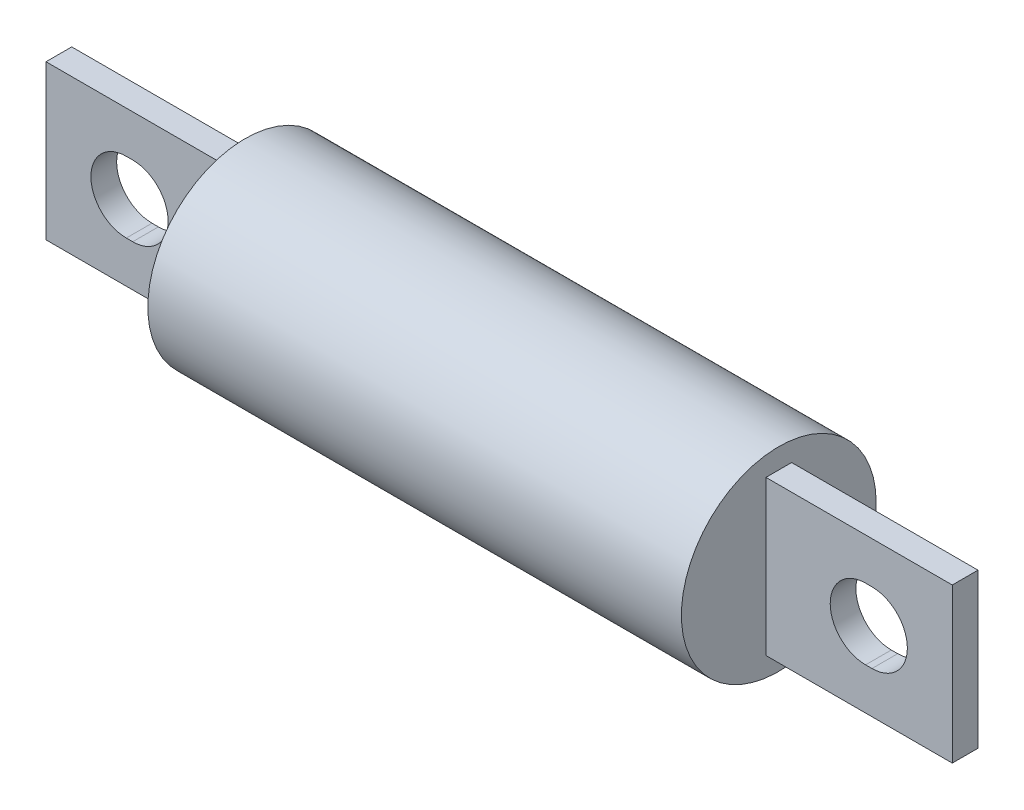
ISO-10303-21;
HEADER;
FILE_DESCRIPTION(('STEP AP214'),'2;1');
FILE_NAME('part.step','',(''),(''),'','','');
FILE_SCHEMA(('AUTOMOTIVE_DESIGN { 1 0 10303 214 1 1 1 1 }'));
ENDSEC;
DATA;
#1=APPLICATION_CONTEXT('core data for automotive mechanical design processes');
#2=APPLICATION_PROTOCOL_DEFINITION('international standard','automotive_design',2000,#1);
#3=PRODUCT_CONTEXT('',#1,'mechanical');
#4=PRODUCT('Part','Part','',(#3));
#5=PRODUCT_RELATED_PRODUCT_CATEGORY('part','',(#4));
#6=PRODUCT_DEFINITION_FORMATION('','',#4);
#7=PRODUCT_DEFINITION_CONTEXT('part definition',#1,'design');
#8=PRODUCT_DEFINITION('design','',#6,#7);
#9=PRODUCT_DEFINITION_SHAPE('','',#8);
#10=(LENGTH_UNIT() NAMED_UNIT(*) SI_UNIT(.MILLI.,.METRE.));
#11=(NAMED_UNIT(*) PLANE_ANGLE_UNIT() SI_UNIT($,.RADIAN.));
#12=(NAMED_UNIT(*) SI_UNIT($,.STERADIAN.) SOLID_ANGLE_UNIT());
#13=UNCERTAINTY_MEASURE_WITH_UNIT(LENGTH_MEASURE(1.E-05),#10,'distance_accuracy_value','');
#14=(GEOMETRIC_REPRESENTATION_CONTEXT(3) GLOBAL_UNCERTAINTY_ASSIGNED_CONTEXT((#13)) GLOBAL_UNIT_ASSIGNED_CONTEXT((#10,
#11,#12)) REPRESENTATION_CONTEXT('',''));
#15=CARTESIAN_POINT('',(0.,0.,0.));
#16=DIRECTION('',(0.,0.,1.));
#17=DIRECTION('',(1.,0.,0.));
#18=AXIS2_PLACEMENT_3D('',#15,#16,#17);
#19=CARTESIAN_POINT('',(65.8876,0.,0.));
#20=DIRECTION('',(-1.,0.,0.));
#21=DIRECTION('',(0.,0.,1.));
#22=AXIS2_PLACEMENT_3D('',#19,#20,#21);
#23=CYLINDRICAL_SURFACE('',#22,12.0269);
#24=CARTESIAN_POINT('',(65.8876,0.,0.));
#25=DIRECTION('',(1.,0.,0.));
#26=DIRECTION('',(0.,0.,-1.));
#27=AXIS2_PLACEMENT_3D('',#24,#25,#26);
#28=CIRCLE('',#27,12.0269);
#29=CARTESIAN_POINT('',(65.8876,0.,-12.0269));
#30=VERTEX_POINT('',#29);
#31=EDGE_CURVE('E255',#30,#30,#28,.T.);
#32=ORIENTED_EDGE('',*,*,#31,.F.);
#33=EDGE_LOOP('',(#32));
#34=FACE_BOUND('',#33,.T.);
#35=CARTESIAN_POINT('',(0.,0.,0.));
#36=DIRECTION('',(1.,0.,0.));
#37=DIRECTION('',(0.,0.,-1.));
#38=AXIS2_PLACEMENT_3D('',#35,#36,#37);
#39=CIRCLE('',#38,12.0269);
#40=CARTESIAN_POINT('',(0.,0.,-12.0269));
#41=VERTEX_POINT('',#40);
#42=EDGE_CURVE('E254',#41,#41,#39,.T.);
#43=ORIENTED_EDGE('',*,*,#42,.T.);
#44=EDGE_LOOP('',(#43));
#45=FACE_BOUND('',#44,.T.);
#46=ADVANCED_FACE('F37',(#34,#45),#23,.T.);
#47=CARTESIAN_POINT('',(65.8876,0.,0.));
#48=DIRECTION('',(1.,0.,0.));
#49=DIRECTION('',(0.,0.,-1.));
#50=AXIS2_PLACEMENT_3D('',#47,#48,#49);
#51=PLANE('',#50);
#52=DIRECTION('',(0.,1.,0.));
#53=VECTOR('',#52,1.);
#54=CARTESIAN_POINT('',(65.8876,0.,-1.5875));
#55=LINE('',#54,#53);
#56=CARTESIAN_POINT('',(65.8876,-9.525,-1.5875));
#57=VERTEX_POINT('',#56);
#58=CARTESIAN_POINT('',(65.8876,9.525,-1.5875));
#59=VERTEX_POINT('',#58);
#60=EDGE_CURVE('E251',#57,#59,#55,.T.);
#61=ORIENTED_EDGE('',*,*,#60,.F.);
#62=DIRECTION('',(0.,0.,-1.));
#63=VECTOR('',#62,1.);
#64=CARTESIAN_POINT('',(65.8876,-9.525,0.));
#65=LINE('',#64,#63);
#66=CARTESIAN_POINT('',(65.8876,-9.525,1.5875));
#67=VERTEX_POINT('',#66);
#68=EDGE_CURVE('E248',#67,#57,#65,.T.);
#69=ORIENTED_EDGE('',*,*,#68,.F.);
#70=DIRECTION('',(0.,-1.,0.));
#71=VECTOR('',#70,1.);
#72=CARTESIAN_POINT('',(65.8876,0.,1.5875));
#73=LINE('',#72,#71);
#74=CARTESIAN_POINT('',(65.8876,9.525,1.5875));
#75=VERTEX_POINT('',#74);
#76=EDGE_CURVE('E245',#75,#67,#73,.T.);
#77=ORIENTED_EDGE('',*,*,#76,.F.);
#78=DIRECTION('',(0.,0.,1.));
#79=VECTOR('',#78,1.);
#80=CARTESIAN_POINT('',(65.8876,9.525,0.));
#81=LINE('',#80,#79);
#82=EDGE_CURVE('E231',#59,#75,#81,.T.);
#83=ORIENTED_EDGE('',*,*,#82,.F.);
#84=EDGE_LOOP('',(#61,#69,#77,#83));
#85=FACE_BOUND('',#84,.T.);
#86=ORIENTED_EDGE('',*,*,#31,.T.);
#87=EDGE_LOOP('',(#86));
#88=FACE_BOUND('',#87,.T.);
#89=ADVANCED_FACE('F316',(#85,#88),#51,.T.);
#90=CARTESIAN_POINT('',(0.,0.,0.));
#91=DIRECTION('',(1.,0.,0.));
#92=DIRECTION('',(0.,0.,-1.));
#93=AXIS2_PLACEMENT_3D('',#90,#91,#92);
#94=PLANE('',#93);
#95=DIRECTION('',(0.,0.,-1.));
#96=VECTOR('',#95,1.);
#97=CARTESIAN_POINT('',(0.,-9.525,0.));
#98=LINE('',#97,#96);
#99=CARTESIAN_POINT('',(0.,-9.525,1.5875));
#100=VERTEX_POINT('',#99);
#101=CARTESIAN_POINT('',(0.,-9.525,-1.5875));
#102=VERTEX_POINT('',#101);
#103=EDGE_CURVE('E266',#100,#102,#98,.T.);
#104=ORIENTED_EDGE('',*,*,#103,.T.);
#105=DIRECTION('',(0.,1.,0.));
#106=VECTOR('',#105,1.);
#107=CARTESIAN_POINT('',(0.,0.,-1.5875));
#108=LINE('',#107,#106);
#109=CARTESIAN_POINT('',(0.,9.525,-1.5875));
#110=VERTEX_POINT('',#109);
#111=EDGE_CURVE('E269',#102,#110,#108,.T.);
#112=ORIENTED_EDGE('',*,*,#111,.T.);
#113=DIRECTION('',(0.,0.,1.));
#114=VECTOR('',#113,1.);
#115=CARTESIAN_POINT('',(0.,9.525,0.));
#116=LINE('',#115,#114);
#117=CARTESIAN_POINT('',(0.,9.525,1.5875));
#118=VERTEX_POINT('',#117);
#119=EDGE_CURVE('E258',#110,#118,#116,.T.);
#120=ORIENTED_EDGE('',*,*,#119,.T.);
#121=DIRECTION('',(0.,-1.,0.));
#122=VECTOR('',#121,1.);
#123=CARTESIAN_POINT('',(0.,0.,1.5875));
#124=LINE('',#123,#122);
#125=EDGE_CURVE('E263',#118,#100,#124,.T.);
#126=ORIENTED_EDGE('',*,*,#125,.T.);
#127=EDGE_LOOP('',(#104,#112,#120,#126));
#128=FACE_BOUND('',#127,.T.);
#129=ORIENTED_EDGE('',*,*,#42,.F.);
#130=EDGE_LOOP('',(#129));
#131=FACE_BOUND('',#130,.T.);
#132=ADVANCED_FACE('F338',(#128,#131),#94,.F.);
#133=CARTESIAN_POINT('',(-23.0124,0.,0.));
#134=DIRECTION('',(1.,0.,0.));
#135=DIRECTION('',(0.,0.,-1.));
#136=AXIS2_PLACEMENT_3D('',#133,#134,#135);
#137=PLANE('',#136);
#138=DIRECTION('',(0.,1.,0.));
#139=VECTOR('',#138,1.);
#140=CARTESIAN_POINT('',(-23.0124,9.525,-1.5875));
#141=LINE('',#140,#139);
#142=CARTESIAN_POINT('',(-23.0124,-9.525,-1.5875));
#143=VERTEX_POINT('',#142);
#144=CARTESIAN_POINT('',(-23.0124,9.525,-1.5875));
#145=VERTEX_POINT('',#144);
#146=EDGE_CURVE('E215',#143,#145,#141,.T.);
#147=ORIENTED_EDGE('',*,*,#146,.F.);
#148=DIRECTION('',(0.,0.,-1.));
#149=VECTOR('',#148,1.);
#150=CARTESIAN_POINT('',(-23.0124,-9.525,1.5875));
#151=LINE('',#150,#149);
#152=CARTESIAN_POINT('',(-23.0124,-9.525,1.5875));
#153=VERTEX_POINT('',#152);
#154=EDGE_CURVE('E224',#153,#143,#151,.T.);
#155=ORIENTED_EDGE('',*,*,#154,.F.);
#156=DIRECTION('',(0.,-1.,0.));
#157=VECTOR('',#156,1.);
#158=CARTESIAN_POINT('',(-23.0124,9.525,1.5875));
#159=LINE('',#158,#157);
#160=CARTESIAN_POINT('',(-23.0124,9.525,1.5875));
#161=VERTEX_POINT('',#160);
#162=EDGE_CURVE('E221',#161,#153,#159,.T.);
#163=ORIENTED_EDGE('',*,*,#162,.F.);
#164=DIRECTION('',(0.,0.,1.));
#165=VECTOR('',#164,1.);
#166=CARTESIAN_POINT('',(-23.0124,9.525,1.5875));
#167=LINE('',#166,#165);
#168=EDGE_CURVE('E218',#145,#161,#167,.T.);
#169=ORIENTED_EDGE('',*,*,#168,.F.);
#170=EDGE_LOOP('',(#147,#155,#163,#169));
#171=FACE_BOUND('',#170,.T.);
#172=ADVANCED_FACE('F331',(#171),#137,.F.);
#173=CARTESIAN_POINT('',(-23.0124,9.525,1.5875));
#174=DIRECTION('',(0.,1.,0.));
#175=DIRECTION('',(0.,0.,1.));
#176=AXIS2_PLACEMENT_3D('',#173,#174,#175);
#177=PLANE('',#176);
#178=ORIENTED_EDGE('',*,*,#119,.F.);
#179=DIRECTION('',(1.,0.,0.));
#180=VECTOR('',#179,1.);
#181=CARTESIAN_POINT('',(-23.0124,9.525,-1.5875));
#182=LINE('',#181,#180);
#183=EDGE_CURVE('E240',#145,#110,#182,.T.);
#184=ORIENTED_EDGE('',*,*,#183,.F.);
#185=ORIENTED_EDGE('',*,*,#168,.T.);
#186=DIRECTION('',(1.,0.,0.));
#187=VECTOR('',#186,1.);
#188=CARTESIAN_POINT('',(-23.0124,9.525,1.5875));
#189=LINE('',#188,#187);
#190=EDGE_CURVE('E237',#161,#118,#189,.T.);
#191=ORIENTED_EDGE('',*,*,#190,.T.);
#192=EDGE_LOOP('',(#178,#184,#185,#191));
#193=FACE_BOUND('',#192,.T.);
#194=ADVANCED_FACE('F322',(#193),#177,.T.);
#195=CARTESIAN_POINT('',(-23.0124,9.525,1.5875));
#196=DIRECTION('',(0.,0.,1.));
#197=DIRECTION('',(0.,-1.,0.));
#198=AXIS2_PLACEMENT_3D('',#195,#196,#197);
#199=PLANE('',#198);
#200=CARTESIAN_POINT('',(-13.095,0.,1.5875));
#201=DIRECTION('',(0.,0.,1.));
#202=DIRECTION('',(0.,-1.,0.));
#203=AXIS2_PLACEMENT_3D('',#200,#201,#202);
#204=CIRCLE('',#203,4.37);
#205=CARTESIAN_POINT('',(-13.095,4.37,1.5875));
#206=VERTEX_POINT('',#205);
#207=CARTESIAN_POINT('',(-13.095,-4.37,1.5875));
#208=VERTEX_POINT('',#207);
#209=EDGE_CURVE('E181',#206,#208,#204,.T.);
#210=ORIENTED_EDGE('',*,*,#209,.F.);
#211=DIRECTION('',(-1.,0.,0.));
#212=VECTOR('',#211,1.);
#213=CARTESIAN_POINT('',(-23.0124,4.37,1.5875));
#214=LINE('',#213,#212);
#215=CARTESIAN_POINT('',(-12.305,4.37,1.5875));
#216=VERTEX_POINT('',#215);
#217=EDGE_CURVE('E174',#216,#206,#214,.T.);
#218=ORIENTED_EDGE('',*,*,#217,.F.);
#219=CARTESIAN_POINT('',(-12.305,0.,1.5875));
#220=DIRECTION('',(0.,0.,1.));
#221=DIRECTION('',(0.,-1.,0.));
#222=AXIS2_PLACEMENT_3D('',#219,#220,#221);
#223=CIRCLE('',#222,4.37);
#224=CARTESIAN_POINT('',(-12.305,-4.37,1.5875));
#225=VERTEX_POINT('',#224);
#226=EDGE_CURVE('E154',#225,#216,#223,.T.);
#227=ORIENTED_EDGE('',*,*,#226,.F.);
#228=DIRECTION('',(1.,0.,0.));
#229=VECTOR('',#228,1.);
#230=CARTESIAN_POINT('',(-23.0124,-4.37,1.5875));
#231=LINE('',#230,#229);
#232=EDGE_CURVE('E179',#208,#225,#231,.T.);
#233=ORIENTED_EDGE('',*,*,#232,.F.);
#234=EDGE_LOOP('',(#210,#218,#227,#233));
#235=FACE_BOUND('',#234,.T.);
#236=ORIENTED_EDGE('',*,*,#125,.F.);
#237=ORIENTED_EDGE('',*,*,#190,.F.);
#238=ORIENTED_EDGE('',*,*,#162,.T.);
#239=DIRECTION('',(1.,0.,0.));
#240=VECTOR('',#239,1.);
#241=CARTESIAN_POINT('',(-23.0124,-9.525,1.5875));
#242=LINE('',#241,#240);
#243=EDGE_CURVE('E233',#153,#100,#242,.T.);
#244=ORIENTED_EDGE('',*,*,#243,.T.);
#245=EDGE_LOOP('',(#236,#237,#238,#244));
#246=FACE_BOUND('',#245,.T.);
#247=ADVANCED_FACE('F329',(#235,#246),#199,.T.);
#248=CARTESIAN_POINT('',(-23.0124,-9.525,1.5875));
#249=DIRECTION('',(0.,-1.,0.));
#250=DIRECTION('',(0.,0.,-1.));
#251=AXIS2_PLACEMENT_3D('',#248,#249,#250);
#252=PLANE('',#251);
#253=ORIENTED_EDGE('',*,*,#103,.F.);
#254=ORIENTED_EDGE('',*,*,#243,.F.);
#255=ORIENTED_EDGE('',*,*,#154,.T.);
#256=DIRECTION('',(1.,0.,0.));
#257=VECTOR('',#256,1.);
#258=CARTESIAN_POINT('',(-23.0124,-9.525,-1.5875));
#259=LINE('',#258,#257);
#260=EDGE_CURVE('E228',#143,#102,#259,.T.);
#261=ORIENTED_EDGE('',*,*,#260,.T.);
#262=EDGE_LOOP('',(#253,#254,#255,#261));
#263=FACE_BOUND('',#262,.T.);
#264=ADVANCED_FACE('F353',(#263),#252,.T.);
#265=CARTESIAN_POINT('',(-23.0124,9.525,-1.5875));
#266=DIRECTION('',(0.,0.,-1.));
#267=DIRECTION('',(0.,1.,0.));
#268=AXIS2_PLACEMENT_3D('',#265,#266,#267);
#269=PLANE('',#268);
#270=CARTESIAN_POINT('',(-13.095,0.,-1.5875));
#271=DIRECTION('',(0.,0.,-1.));
#272=DIRECTION('',(0.,1.,0.));
#273=AXIS2_PLACEMENT_3D('',#270,#271,#272);
#274=CIRCLE('',#273,4.37);
#275=CARTESIAN_POINT('',(-13.095,-4.37,-1.5875));
#276=VERTEX_POINT('',#275);
#277=CARTESIAN_POINT('',(-13.095,4.37,-1.5875));
#278=VERTEX_POINT('',#277);
#279=EDGE_CURVE('E59',#276,#278,#274,.T.);
#280=ORIENTED_EDGE('',*,*,#279,.F.);
#281=DIRECTION('',(-1.,0.,0.));
#282=VECTOR('',#281,1.);
#283=CARTESIAN_POINT('',(-13.095,-4.37,-1.5875));
#284=LINE('',#283,#282);
#285=CARTESIAN_POINT('',(-12.305,-4.37,-1.5875));
#286=VERTEX_POINT('',#285);
#287=EDGE_CURVE('E167',#286,#276,#284,.T.);
#288=ORIENTED_EDGE('',*,*,#287,.F.);
#289=CARTESIAN_POINT('',(-12.305,0.,-1.5875));
#290=DIRECTION('',(0.,0.,-1.));
#291=DIRECTION('',(0.,1.,0.));
#292=AXIS2_PLACEMENT_3D('',#289,#290,#291);
#293=CIRCLE('',#292,4.37);
#294=CARTESIAN_POINT('',(-12.305,4.37,-1.5875));
#295=VERTEX_POINT('',#294);
#296=EDGE_CURVE('E151',#295,#286,#293,.T.);
#297=ORIENTED_EDGE('',*,*,#296,.F.);
#298=DIRECTION('',(1.,0.,0.));
#299=VECTOR('',#298,1.);
#300=CARTESIAN_POINT('',(-13.095,4.37,-1.5875));
#301=LINE('',#300,#299);
#302=EDGE_CURVE('E160',#278,#295,#301,.T.);
#303=ORIENTED_EDGE('',*,*,#302,.F.);
#304=EDGE_LOOP('',(#280,#288,#297,#303));
#305=FACE_BOUND('',#304,.T.);
#306=ORIENTED_EDGE('',*,*,#111,.F.);
#307=ORIENTED_EDGE('',*,*,#260,.F.);
#308=ORIENTED_EDGE('',*,*,#146,.T.);
#309=ORIENTED_EDGE('',*,*,#183,.T.);
#310=EDGE_LOOP('',(#306,#307,#308,#309));
#311=FACE_BOUND('',#310,.T.);
#312=ADVANCED_FACE('F164',(#305,#311),#269,.T.);
#313=CARTESIAN_POINT('',(78.9813,0.,-1.5875));
#314=DIRECTION('',(0.,0.,-1.));
#315=DIRECTION('',(0.,1.,0.));
#316=AXIS2_PLACEMENT_3D('',#313,#314,#315);
#317=CIRCLE('',#316,4.3688);
#318=CARTESIAN_POINT('',(78.9813,4.3688,-1.5875));
#319=VERTEX_POINT('',#318);
#320=CARTESIAN_POINT('',(78.9813,-4.3688,-1.5875));
#321=VERTEX_POINT('',#320);
#322=EDGE_CURVE('E183',#319,#321,#317,.T.);
#323=ORIENTED_EDGE('',*,*,#322,.F.);
#324=DIRECTION('',(1.,0.,0.));
#325=VECTOR('',#324,1.);
#326=CARTESIAN_POINT('',(78.9813,4.3688,-1.5875));
#327=LINE('',#326,#325);
#328=CARTESIAN_POINT('',(78.1939,4.3688,-1.5875));
#329=VERTEX_POINT('',#328);
#330=EDGE_CURVE('E191',#329,#319,#327,.T.);
#331=ORIENTED_EDGE('',*,*,#330,.F.);
#332=CARTESIAN_POINT('',(78.1939,0.,-1.5875));
#333=DIRECTION('',(0.,0.,-1.));
#334=DIRECTION('',(0.,1.,0.));
#335=AXIS2_PLACEMENT_3D('',#332,#333,#334);
#336=CIRCLE('',#335,4.3688);
#337=CARTESIAN_POINT('',(78.1939,-4.3688,-1.5875));
#338=VERTEX_POINT('',#337);
#339=EDGE_CURVE('E188',#338,#329,#336,.T.);
#340=ORIENTED_EDGE('',*,*,#339,.F.);
#341=DIRECTION('',(-1.,0.,0.));
#342=VECTOR('',#341,1.);
#343=CARTESIAN_POINT('',(78.9813,-4.3688,-1.5875));
#344=LINE('',#343,#342);
#345=EDGE_CURVE('E185',#321,#338,#344,.T.);
#346=ORIENTED_EDGE('',*,*,#345,.F.);
#347=EDGE_LOOP('',(#323,#331,#340,#346));
#348=FACE_BOUND('',#347,.T.);
#349=CARTESIAN_POINT('',(88.9,-9.525,-1.5875));
#350=VERTEX_POINT('',#349);
#351=EDGE_CURVE('E232',#57,#350,#259,.T.);
#352=ORIENTED_EDGE('',*,*,#351,.F.);
#353=ORIENTED_EDGE('',*,*,#60,.T.);
#354=CARTESIAN_POINT('',(88.9,9.525,-1.5875));
#355=VERTEX_POINT('',#354);
#356=EDGE_CURVE('E227',#59,#355,#182,.T.);
#357=ORIENTED_EDGE('',*,*,#356,.T.);
#358=DIRECTION('',(0.,1.,0.));
#359=VECTOR('',#358,1.);
#360=CARTESIAN_POINT('',(88.9,9.525,-1.5875));
#361=LINE('',#360,#359);
#362=EDGE_CURVE('E197',#350,#355,#361,.T.);
#363=ORIENTED_EDGE('',*,*,#362,.F.);
#364=EDGE_LOOP('',(#352,#353,#357,#363));
#365=FACE_BOUND('',#364,.T.);
#366=ADVANCED_FACE('F299',(#348,#365),#269,.T.);
#367=CARTESIAN_POINT('',(88.9,-9.525,1.5875));
#368=VERTEX_POINT('',#367);
#369=EDGE_CURVE('E236',#67,#368,#242,.T.);
#370=ORIENTED_EDGE('',*,*,#369,.F.);
#371=ORIENTED_EDGE('',*,*,#68,.T.);
#372=ORIENTED_EDGE('',*,*,#351,.T.);
#373=DIRECTION('',(0.,0.,-1.));
#374=VECTOR('',#373,1.);
#375=CARTESIAN_POINT('',(88.9,-9.525,1.5875));
#376=LINE('',#375,#374);
#377=EDGE_CURVE('E212',#368,#350,#376,.T.);
#378=ORIENTED_EDGE('',*,*,#377,.F.);
#379=EDGE_LOOP('',(#370,#371,#372,#378));
#380=FACE_BOUND('',#379,.T.);
#381=ADVANCED_FACE('F302',(#380),#252,.T.);
#382=CARTESIAN_POINT('',(78.9813,0.,1.5875));
#383=DIRECTION('',(0.,0.,1.));
#384=DIRECTION('',(0.,-1.,0.));
#385=AXIS2_PLACEMENT_3D('',#382,#383,#384);
#386=CIRCLE('',#385,4.3688);
#387=CARTESIAN_POINT('',(78.9813,-4.3688,1.5875));
#388=VERTEX_POINT('',#387);
#389=CARTESIAN_POINT('',(78.9813,4.3688,1.5875));
#390=VERTEX_POINT('',#389);
#391=EDGE_CURVE('E11',#388,#390,#386,.T.);
#392=ORIENTED_EDGE('',*,*,#391,.F.);
#393=DIRECTION('',(1.,0.,0.));
#394=VECTOR('',#393,1.);
#395=CARTESIAN_POINT('',(-23.0124,-4.3688,1.5875));
#396=LINE('',#395,#394);
#397=CARTESIAN_POINT('',(78.1939,-4.3688,1.5875));
#398=VERTEX_POINT('',#397);
#399=EDGE_CURVE('E272',#398,#388,#396,.T.);
#400=ORIENTED_EDGE('',*,*,#399,.F.);
#401=CARTESIAN_POINT('',(78.1939,0.,1.5875));
#402=DIRECTION('',(0.,0.,1.));
#403=DIRECTION('',(0.,-1.,0.));
#404=AXIS2_PLACEMENT_3D('',#401,#402,#403);
#405=CIRCLE('',#404,4.3688);
#406=CARTESIAN_POINT('',(78.1939,4.3688,1.5875));
#407=VERTEX_POINT('',#406);
#408=EDGE_CURVE('E274',#407,#398,#405,.T.);
#409=ORIENTED_EDGE('',*,*,#408,.F.);
#410=DIRECTION('',(-1.,0.,0.));
#411=VECTOR('',#410,1.);
#412=CARTESIAN_POINT('',(-23.0124,4.3688,1.5875));
#413=LINE('',#412,#411);
#414=EDGE_CURVE('E44',#390,#407,#413,.T.);
#415=ORIENTED_EDGE('',*,*,#414,.F.);
#416=EDGE_LOOP('',(#392,#400,#409,#415));
#417=FACE_BOUND('',#416,.T.);
#418=CARTESIAN_POINT('',(88.9,9.525,1.5875));
#419=VERTEX_POINT('',#418);
#420=EDGE_CURVE('E239',#75,#419,#189,.T.);
#421=ORIENTED_EDGE('',*,*,#420,.F.);
#422=ORIENTED_EDGE('',*,*,#76,.T.);
#423=ORIENTED_EDGE('',*,*,#369,.T.);
#424=DIRECTION('',(0.,-1.,0.));
#425=VECTOR('',#424,1.);
#426=CARTESIAN_POINT('',(88.9,9.525,1.5875));
#427=LINE('',#426,#425);
#428=EDGE_CURVE('E209',#419,#368,#427,.T.);
#429=ORIENTED_EDGE('',*,*,#428,.F.);
#430=EDGE_LOOP('',(#421,#422,#423,#429));
#431=FACE_BOUND('',#430,.T.);
#432=ADVANCED_FACE('F289',(#417,#431),#199,.T.);
#433=ORIENTED_EDGE('',*,*,#356,.F.);
#434=ORIENTED_EDGE('',*,*,#82,.T.);
#435=ORIENTED_EDGE('',*,*,#420,.T.);
#436=DIRECTION('',(0.,0.,1.));
#437=VECTOR('',#436,1.);
#438=CARTESIAN_POINT('',(88.9,9.525,1.5875));
#439=LINE('',#438,#437);
#440=EDGE_CURVE('E206',#355,#419,#439,.T.);
#441=ORIENTED_EDGE('',*,*,#440,.F.);
#442=EDGE_LOOP('',(#433,#434,#435,#441));
#443=FACE_BOUND('',#442,.T.);
#444=ADVANCED_FACE('F319',(#443),#177,.T.);
#445=CARTESIAN_POINT('',(88.9,0.,0.));
#446=DIRECTION('',(1.,0.,0.));
#447=DIRECTION('',(0.,0.,-1.));
#448=AXIS2_PLACEMENT_3D('',#445,#446,#447);
#449=PLANE('',#448);
#450=ORIENTED_EDGE('',*,*,#362,.T.);
#451=ORIENTED_EDGE('',*,*,#440,.T.);
#452=ORIENTED_EDGE('',*,*,#428,.T.);
#453=ORIENTED_EDGE('',*,*,#377,.T.);
#454=EDGE_LOOP('',(#450,#451,#452,#453));
#455=FACE_BOUND('',#454,.T.);
#456=ADVANCED_FACE('F311',(#455),#449,.T.);
#457=CARTESIAN_POINT('',(78.9813,0.,21.4249));
#458=DIRECTION('',(0.,0.,-1.));
#459=DIRECTION('',(0.,1.,0.));
#460=AXIS2_PLACEMENT_3D('',#457,#458,#459);
#461=CYLINDRICAL_SURFACE('',#460,4.3688);
#462=ORIENTED_EDGE('',*,*,#391,.T.);
#463=DIRECTION('',(0.,0.,-1.));
#464=VECTOR('',#463,1.);
#465=CARTESIAN_POINT('',(78.9813,4.3688,21.4249));
#466=LINE('',#465,#464);
#467=EDGE_CURVE('E195',#390,#319,#466,.T.);
#468=ORIENTED_EDGE('',*,*,#467,.T.);
#469=ORIENTED_EDGE('',*,*,#322,.T.);
#470=DIRECTION('',(0.,0.,-1.));
#471=VECTOR('',#470,1.);
#472=CARTESIAN_POINT('',(78.9813,-4.3688,21.4249));
#473=LINE('',#472,#471);
#474=EDGE_CURVE('E194',#388,#321,#473,.T.);
#475=ORIENTED_EDGE('',*,*,#474,.F.);
#476=EDGE_LOOP('',(#462,#468,#469,#475));
#477=FACE_BOUND('',#476,.T.);
#478=ADVANCED_FACE('F296',(#477),#461,.F.);
#479=CARTESIAN_POINT('',(78.9813,4.3688,21.4249));
#480=DIRECTION('',(0.,1.,0.));
#481=DIRECTION('',(0.,0.,1.));
#482=AXIS2_PLACEMENT_3D('',#479,#480,#481);
#483=PLANE('',#482);
#484=ORIENTED_EDGE('',*,*,#414,.T.);
#485=DIRECTION('',(0.,0.,-1.));
#486=VECTOR('',#485,1.);
#487=CARTESIAN_POINT('',(78.1939,4.3688,21.4249));
#488=LINE('',#487,#486);
#489=EDGE_CURVE('E198',#407,#329,#488,.T.);
#490=ORIENTED_EDGE('',*,*,#489,.T.);
#491=ORIENTED_EDGE('',*,*,#330,.T.);
#492=ORIENTED_EDGE('',*,*,#467,.F.);
#493=EDGE_LOOP('',(#484,#490,#491,#492));
#494=FACE_BOUND('',#493,.T.);
#495=ADVANCED_FACE('F280',(#494),#483,.F.);
#496=CARTESIAN_POINT('',(78.1939,0.,21.4249));
#497=DIRECTION('',(0.,0.,-1.));
#498=DIRECTION('',(0.,1.,0.));
#499=AXIS2_PLACEMENT_3D('',#496,#497,#498);
#500=CYLINDRICAL_SURFACE('',#499,4.3688);
#501=ORIENTED_EDGE('',*,*,#408,.T.);
#502=DIRECTION('',(0.,0.,-1.));
#503=VECTOR('',#502,1.);
#504=CARTESIAN_POINT('',(78.1939,-4.3688,21.4249));
#505=LINE('',#504,#503);
#506=EDGE_CURVE('E200',#398,#338,#505,.T.);
#507=ORIENTED_EDGE('',*,*,#506,.T.);
#508=ORIENTED_EDGE('',*,*,#339,.T.);
#509=ORIENTED_EDGE('',*,*,#489,.F.);
#510=EDGE_LOOP('',(#501,#507,#508,#509));
#511=FACE_BOUND('',#510,.T.);
#512=ADVANCED_FACE('F285',(#511),#500,.F.);
#513=CARTESIAN_POINT('',(78.9813,-4.3688,21.4249));
#514=DIRECTION('',(0.,-1.,0.));
#515=DIRECTION('',(0.,0.,-1.));
#516=AXIS2_PLACEMENT_3D('',#513,#514,#515);
#517=PLANE('',#516);
#518=ORIENTED_EDGE('',*,*,#399,.T.);
#519=ORIENTED_EDGE('',*,*,#474,.T.);
#520=ORIENTED_EDGE('',*,*,#345,.T.);
#521=ORIENTED_EDGE('',*,*,#506,.F.);
#522=EDGE_LOOP('',(#518,#519,#520,#521));
#523=FACE_BOUND('',#522,.T.);
#524=ADVANCED_FACE('F293',(#523),#517,.F.);
#525=CARTESIAN_POINT('',(-13.095,0.,21.4249));
#526=DIRECTION('',(0.,0.,-1.));
#527=DIRECTION('',(0.,1.,0.));
#528=AXIS2_PLACEMENT_3D('',#525,#526,#527);
#529=CYLINDRICAL_SURFACE('',#528,4.37);
#530=ORIENTED_EDGE('',*,*,#209,.T.);
#531=DIRECTION('',(0.,0.,-1.));
#532=VECTOR('',#531,1.);
#533=CARTESIAN_POINT('',(-13.095,-4.37,21.4249));
#534=LINE('',#533,#532);
#535=EDGE_CURVE('E172',#208,#276,#534,.T.);
#536=ORIENTED_EDGE('',*,*,#535,.T.);
#537=ORIENTED_EDGE('',*,*,#279,.T.);
#538=DIRECTION('',(0.,0.,-1.));
#539=VECTOR('',#538,1.);
#540=CARTESIAN_POINT('',(-13.095,4.37,21.4249));
#541=LINE('',#540,#539);
#542=EDGE_CURVE('E157',#206,#278,#541,.T.);
#543=ORIENTED_EDGE('',*,*,#542,.F.);
#544=EDGE_LOOP('',(#530,#536,#537,#543));
#545=FACE_BOUND('',#544,.T.);
#546=ADVANCED_FACE('F415',(#545),#529,.F.);
#547=CARTESIAN_POINT('',(-13.095,-4.37,21.4249));
#548=DIRECTION('',(0.,-1.,0.));
#549=DIRECTION('',(0.,0.,-1.));
#550=AXIS2_PLACEMENT_3D('',#547,#548,#549);
#551=PLANE('',#550);
#552=ORIENTED_EDGE('',*,*,#232,.T.);
#553=DIRECTION('',(0.,0.,-1.));
#554=VECTOR('',#553,1.);
#555=CARTESIAN_POINT('',(-12.305,-4.37,21.4249));
#556=LINE('',#555,#554);
#557=EDGE_CURVE('E156',#225,#286,#556,.T.);
#558=ORIENTED_EDGE('',*,*,#557,.T.);
#559=ORIENTED_EDGE('',*,*,#287,.T.);
#560=ORIENTED_EDGE('',*,*,#535,.F.);
#561=EDGE_LOOP('',(#552,#558,#559,#560));
#562=FACE_BOUND('',#561,.T.);
#563=ADVANCED_FACE('F436',(#562),#551,.F.);
#564=CARTESIAN_POINT('',(-12.305,0.,21.4249));
#565=DIRECTION('',(0.,0.,-1.));
#566=DIRECTION('',(0.,1.,0.));
#567=AXIS2_PLACEMENT_3D('',#564,#565,#566);
#568=CYLINDRICAL_SURFACE('',#567,4.37);
#569=ORIENTED_EDGE('',*,*,#226,.T.);
#570=DIRECTION('',(0.,0.,-1.));
#571=VECTOR('',#570,1.);
#572=CARTESIAN_POINT('',(-12.305,4.36999999999999,21.4249));
#573=LINE('',#572,#571);
#574=EDGE_CURVE('E51',#216,#295,#573,.T.);
#575=ORIENTED_EDGE('',*,*,#574,.T.);
#576=ORIENTED_EDGE('',*,*,#296,.T.);
#577=ORIENTED_EDGE('',*,*,#557,.F.);
#578=EDGE_LOOP('',(#569,#575,#576,#577));
#579=FACE_BOUND('',#578,.T.);
#580=ADVANCED_FACE('F148',(#579),#568,.F.);
#581=CARTESIAN_POINT('',(-13.095,4.37,21.4249));
#582=DIRECTION('',(0.,1.,0.));
#583=DIRECTION('',(0.,0.,1.));
#584=AXIS2_PLACEMENT_3D('',#581,#582,#583);
#585=PLANE('',#584);
#586=ORIENTED_EDGE('',*,*,#217,.T.);
#587=ORIENTED_EDGE('',*,*,#542,.T.);
#588=ORIENTED_EDGE('',*,*,#302,.T.);
#589=ORIENTED_EDGE('',*,*,#574,.F.);
#590=EDGE_LOOP('',(#586,#587,#588,#589));
#591=FACE_BOUND('',#590,.T.);
#592=ADVANCED_FACE('F161',(#591),#585,.F.);
#593=CLOSED_SHELL('',(#46,#89,#132,#172,#194,#247,#264,#312,#366,#381,#432,#444,#456,#478,#495,
#512,#524,#546,#563,#580,#592));
#594=MANIFOLD_SOLID_BREP('B2',#593);
#595=ADVANCED_BREP_SHAPE_REPRESENTATION('',(#18,#594),#14);
#596=SHAPE_DEFINITION_REPRESENTATION(#9,#595);
ENDSEC;
END-ISO-10303-21;
